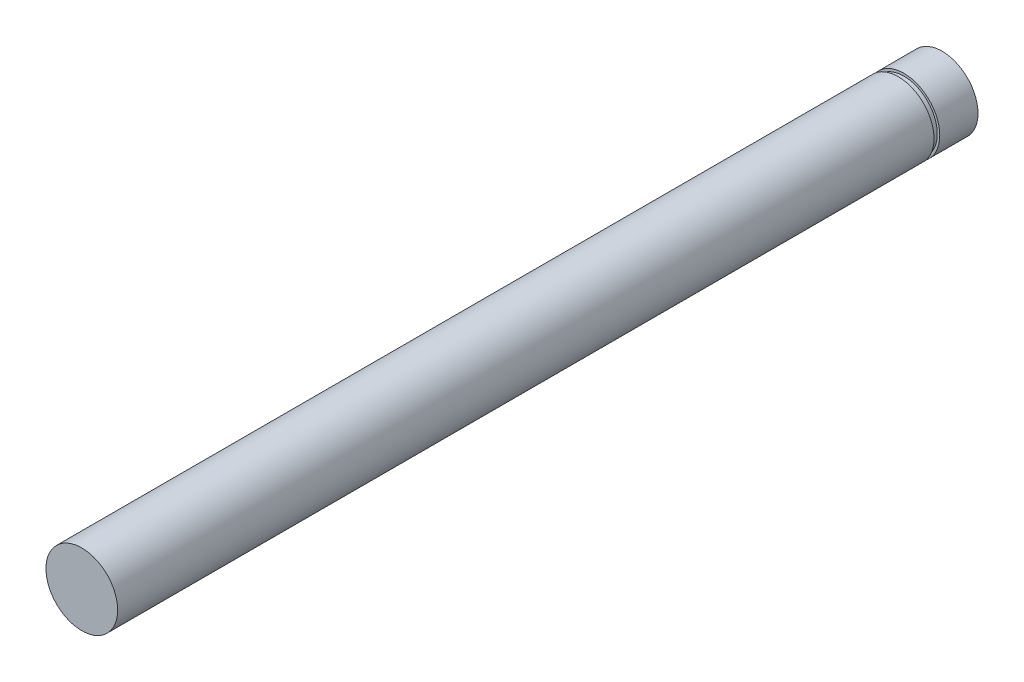
ISO-10303-21;
HEADER;
FILE_DESCRIPTION(('STEP AP214'),'2;1');
FILE_NAME('part.step','',(''),(''),'','','');
FILE_SCHEMA(('AUTOMOTIVE_DESIGN { 1 0 10303 214 1 1 1 1 }'));
ENDSEC;
DATA;
#1=APPLICATION_CONTEXT('core data for automotive mechanical design processes');
#2=APPLICATION_PROTOCOL_DEFINITION('international standard','automotive_design',2000,#1);
#3=PRODUCT_CONTEXT('',#1,'mechanical');
#4=PRODUCT('Part','Part','',(#3));
#5=PRODUCT_RELATED_PRODUCT_CATEGORY('part','',(#4));
#6=PRODUCT_DEFINITION_FORMATION('','',#4);
#7=PRODUCT_DEFINITION_CONTEXT('part definition',#1,'design');
#8=PRODUCT_DEFINITION('design','',#6,#7);
#9=PRODUCT_DEFINITION_SHAPE('','',#8);
#10=(LENGTH_UNIT() NAMED_UNIT(*) SI_UNIT(.MILLI.,.METRE.));
#11=(NAMED_UNIT(*) PLANE_ANGLE_UNIT() SI_UNIT($,.RADIAN.));
#12=(NAMED_UNIT(*) SI_UNIT($,.STERADIAN.) SOLID_ANGLE_UNIT());
#13=UNCERTAINTY_MEASURE_WITH_UNIT(LENGTH_MEASURE(1.E-05),#10,'distance_accuracy_value','');
#14=(GEOMETRIC_REPRESENTATION_CONTEXT(3) GLOBAL_UNCERTAINTY_ASSIGNED_CONTEXT((#13)) GLOBAL_UNIT_ASSIGNED_CONTEXT((#10,
#11,#12)) REPRESENTATION_CONTEXT('',''));
#15=CARTESIAN_POINT('',(0.,0.,0.));
#16=DIRECTION('',(0.,0.,1.));
#17=DIRECTION('',(1.,0.,0.));
#18=AXIS2_PLACEMENT_3D('',#15,#16,#17);
#19=CARTESIAN_POINT('',(0.,0.,-57.15));
#20=DIRECTION('',(0.,0.,1.));
#21=DIRECTION('',(1.,0.,0.));
#22=AXIS2_PLACEMENT_3D('',#19,#20,#21);
#23=CYLINDRICAL_SURFACE('',#22,2.38125);
#24=CARTESIAN_POINT('',(0.,0.,0.));
#25=DIRECTION('',(0.,0.,1.));
#26=DIRECTION('',(1.,0.,0.));
#27=AXIS2_PLACEMENT_3D('',#24,#25,#26);
#28=CIRCLE('',#27,2.38125);
#29=CARTESIAN_POINT('',(2.38125,0.,0.));
#30=VERTEX_POINT('',#29);
#31=EDGE_CURVE('E37',#30,#30,#28,.T.);
#32=ORIENTED_EDGE('',*,*,#31,.F.);
#33=EDGE_LOOP('',(#32));
#34=FACE_BOUND('',#33,.T.);
#35=CARTESIAN_POINT('',(0.,0.,-54.229));
#36=DIRECTION('',(0.,0.,-1.));
#37=DIRECTION('',(-1.,0.,0.));
#38=AXIS2_PLACEMENT_3D('',#35,#36,#37);
#39=CIRCLE('',#38,2.38125);
#40=CARTESIAN_POINT('',(-2.38125,0.,-54.229));
#41=VERTEX_POINT('',#40);
#42=EDGE_CURVE('E44',#41,#41,#39,.T.);
#43=ORIENTED_EDGE('',*,*,#42,.F.);
#44=EDGE_LOOP('',(#43));
#45=FACE_BOUND('',#44,.T.);
#46=ADVANCED_FACE('F33',(#34,#45),#23,.T.);
#47=CARTESIAN_POINT('',(0.,0.,0.));
#48=DIRECTION('',(0.,0.,1.));
#49=DIRECTION('',(1.,0.,0.));
#50=AXIS2_PLACEMENT_3D('',#47,#48,#49);
#51=PLANE('',#50);
#52=ORIENTED_EDGE('',*,*,#31,.T.);
#53=EDGE_LOOP('',(#52));
#54=FACE_BOUND('',#53,.T.);
#55=ADVANCED_FACE('F65',(#54),#51,.T.);
#56=CARTESIAN_POINT('',(0.,0.,-54.229));
#57=DIRECTION('',(0.,0.,-1.));
#58=DIRECTION('',(-1.,0.,0.));
#59=AXIS2_PLACEMENT_3D('',#56,#57,#58);
#60=PLANE('',#59);
#61=CARTESIAN_POINT('',(0.,0.,-54.229));
#62=DIRECTION('',(0.,0.,-1.));
#63=DIRECTION('',(-1.,0.,0.));
#64=AXIS2_PLACEMENT_3D('',#61,#62,#63);
#65=CIRCLE('',#64,2.21603932323596);
#66=CARTESIAN_POINT('',(-2.21603932323596,0.,-54.229));
#67=VERTEX_POINT('',#66);
#68=EDGE_CURVE('E49',#67,#67,#65,.T.);
#69=ORIENTED_EDGE('',*,*,#68,.F.);
#70=EDGE_LOOP('',(#69));
#71=FACE_BOUND('',#70,.T.);
#72=ORIENTED_EDGE('',*,*,#42,.T.);
#73=EDGE_LOOP('',(#72));
#74=FACE_BOUND('',#73,.T.);
#75=ADVANCED_FACE('F61',(#71,#74),#60,.T.);
#76=CARTESIAN_POINT('',(0.,0.,-54.61));
#77=DIRECTION('',(0.,0.,-1.));
#78=DIRECTION('',(-1.,0.,0.));
#79=AXIS2_PLACEMENT_3D('',#76,#77,#78);
#80=PLANE('',#79);
#81=CARTESIAN_POINT('',(0.,0.,-54.61));
#82=DIRECTION('',(0.,0.,-1.));
#83=DIRECTION('',(-1.,0.,0.));
#84=AXIS2_PLACEMENT_3D('',#81,#82,#83);
#85=CIRCLE('',#84,2.21603932323596);
#86=CARTESIAN_POINT('',(-2.21603932323596,0.,-54.61));
#87=VERTEX_POINT('',#86);
#88=EDGE_CURVE('E52',#87,#87,#85,.T.);
#89=ORIENTED_EDGE('',*,*,#88,.T.);
#90=EDGE_LOOP('',(#89));
#91=FACE_BOUND('',#90,.T.);
#92=CARTESIAN_POINT('',(0.,0.,-54.61));
#93=DIRECTION('',(0.,0.,-1.));
#94=DIRECTION('',(-1.,0.,0.));
#95=AXIS2_PLACEMENT_3D('',#92,#93,#94);
#96=CIRCLE('',#95,2.38125);
#97=CARTESIAN_POINT('',(-2.38125,0.,-54.61));
#98=VERTEX_POINT('',#97);
#99=EDGE_CURVE('E46',#98,#98,#96,.T.);
#100=ORIENTED_EDGE('',*,*,#99,.F.);
#101=EDGE_LOOP('',(#100));
#102=FACE_BOUND('',#101,.T.);
#103=ADVANCED_FACE('F64',(#91,#102),#80,.F.);
#104=CARTESIAN_POINT('',(0.,0.,-54.229));
#105=DIRECTION('',(0.,0.,-1.));
#106=DIRECTION('',(-1.,0.,0.));
#107=AXIS2_PLACEMENT_3D('',#104,#105,#106);
#108=CYLINDRICAL_SURFACE('',#107,2.21603932323596);
#109=CARTESIAN_POINT('',(-2.21603932323596,0.,-54.229));
#110=CARTESIAN_POINT('',(-2.21603932323596,0.,-54.23296875));
#111=CARTESIAN_POINT('',(-2.21603932323596,0.,-54.2369375));
#112=CARTESIAN_POINT('',(-2.21603932323596,0.,-54.244875));
#113=CARTESIAN_POINT('',(-2.21603932323596,0.,-54.24884375));
#114=CARTESIAN_POINT('',(-2.21603932323596,0.,-54.25678125));
#115=CARTESIAN_POINT('',(-2.21603932323596,0.,-54.26075));
#116=CARTESIAN_POINT('',(-2.21603932323596,0.,-54.2686875));
#117=CARTESIAN_POINT('',(-2.21603932323596,0.,-54.27265625));
#118=CARTESIAN_POINT('',(-2.21603932323596,0.,-54.28059375));
#119=CARTESIAN_POINT('',(-2.21603932323596,0.,-54.2845625));
#120=CARTESIAN_POINT('',(-2.21603932323596,0.,-54.2925));
#121=CARTESIAN_POINT('',(-2.21603932323596,0.,-54.29646875));
#122=CARTESIAN_POINT('',(-2.21603932323596,0.,-54.30440625));
#123=CARTESIAN_POINT('',(-2.21603932323596,0.,-54.308375));
#124=CARTESIAN_POINT('',(-2.21603932323596,0.,-54.3163125));
#125=CARTESIAN_POINT('',(-2.21603932323596,0.,-54.32028125));
#126=CARTESIAN_POINT('',(-2.21603932323596,0.,-54.32821875));
#127=CARTESIAN_POINT('',(-2.21603932323596,0.,-54.3321875));
#128=CARTESIAN_POINT('',(-2.21603932323596,0.,-54.340125));
#129=CARTESIAN_POINT('',(-2.21603932323596,0.,-54.34409375));
#130=CARTESIAN_POINT('',(-2.21603932323596,0.,-54.35203125));
#131=CARTESIAN_POINT('',(-2.21603932323596,0.,-54.356));
#132=CARTESIAN_POINT('',(-2.21603932323596,0.,-54.3639375));
#133=CARTESIAN_POINT('',(-2.21603932323596,0.,-54.36790625));
#134=CARTESIAN_POINT('',(-2.21603932323596,0.,-54.37584375));
#135=CARTESIAN_POINT('',(-2.21603932323596,0.,-54.3798125));
#136=CARTESIAN_POINT('',(-2.21603932323596,0.,-54.38775));
#137=CARTESIAN_POINT('',(-2.21603932323596,0.,-54.39171875));
#138=CARTESIAN_POINT('',(-2.21603932323596,0.,-54.39965625));
#139=CARTESIAN_POINT('',(-2.21603932323596,0.,-54.403625));
#140=CARTESIAN_POINT('',(-2.21603932323596,0.,-54.4115625));
#141=CARTESIAN_POINT('',(-2.21603932323596,0.,-54.41553125));
#142=CARTESIAN_POINT('',(-2.21603932323596,0.,-54.42346875));
#143=CARTESIAN_POINT('',(-2.21603932323596,0.,-54.4274375));
#144=CARTESIAN_POINT('',(-2.21603932323596,0.,-54.435375));
#145=CARTESIAN_POINT('',(-2.21603932323596,0.,-54.43934375));
#146=CARTESIAN_POINT('',(-2.21603932323596,0.,-54.44728125));
#147=CARTESIAN_POINT('',(-2.21603932323596,0.,-54.45125));
#148=CARTESIAN_POINT('',(-2.21603932323596,0.,-54.4591875));
#149=CARTESIAN_POINT('',(-2.21603932323596,0.,-54.46315625));
#150=CARTESIAN_POINT('',(-2.21603932323596,0.,-54.47109375));
#151=CARTESIAN_POINT('',(-2.21603932323596,0.,-54.4750625));
#152=CARTESIAN_POINT('',(-2.21603932323596,0.,-54.483));
#153=CARTESIAN_POINT('',(-2.21603932323596,0.,-54.48696875));
#154=CARTESIAN_POINT('',(-2.21603932323596,0.,-54.49490625));
#155=CARTESIAN_POINT('',(-2.21603932323596,0.,-54.498875));
#156=CARTESIAN_POINT('',(-2.21603932323596,0.,-54.5068125));
#157=CARTESIAN_POINT('',(-2.21603932323596,0.,-54.51078125));
#158=CARTESIAN_POINT('',(-2.21603932323596,0.,-54.51871875));
#159=CARTESIAN_POINT('',(-2.21603932323596,0.,-54.5226875));
#160=CARTESIAN_POINT('',(-2.21603932323596,0.,-54.530625));
#161=CARTESIAN_POINT('',(-2.21603932323596,0.,-54.53459375));
#162=CARTESIAN_POINT('',(-2.21603932323596,0.,-54.54253125));
#163=CARTESIAN_POINT('',(-2.21603932323596,0.,-54.5465));
#164=CARTESIAN_POINT('',(-2.21603932323596,0.,-54.5544375));
#165=CARTESIAN_POINT('',(-2.21603932323596,0.,-54.55840625));
#166=CARTESIAN_POINT('',(-2.21603932323596,0.,-54.56634375));
#167=CARTESIAN_POINT('',(-2.21603932323596,0.,-54.5703125));
#168=CARTESIAN_POINT('',(-2.21603932323596,0.,-54.57825));
#169=CARTESIAN_POINT('',(-2.21603932323596,0.,-54.58221875));
#170=CARTESIAN_POINT('',(-2.21603932323596,0.,-54.59015625));
#171=CARTESIAN_POINT('',(-2.21603932323596,0.,-54.594125));
#172=CARTESIAN_POINT('',(-2.21603932323596,0.,-54.6020625));
#173=CARTESIAN_POINT('',(-2.21603932323596,0.,-54.60603125));
#174=CARTESIAN_POINT('',(-2.21603932323596,0.,-54.61));
#175=B_SPLINE_CURVE_WITH_KNOTS('',3,(#109,#110,#111,#112,#113,#114,#115,#116,#117,#118,#119,
#120,#121,#122,#123,#124,#125,#126,#127,#128,#129,#130,#131,#132,#133,#134,#135,#136,#137,#138,
#139,#140,#141,#142,#143,#144,#145,#146,#147,#148,#149,#150,#151,#152,#153,#154,#155,#156,#157,
#158,#159,#160,#161,#162,#163,#164,#165,#166,#167,#168,#169,#170,#171,#172,#173,#174),
.UNSPECIFIED.,.F.,.F.,(4,2,2,2,2,2,2,2,2,2,2,2,2,2,2,2,2,2,2,2,2,2,2,2,2,2,2,2,2,2,2,2,4),(0.,
0.0119062500000058,0.0238125000000047,0.0357187500000036,0.0476250000000025,0.0595312500000014,
0.0714375000000003,0.0833437500000062,0.0952500000000051,0.107156250000004,0.119062500000003,
0.130968750000002,0.142875000000001,0.154781250000006,0.166687500000005,0.178593750000004,
0.190500000000003,0.202406250000002,0.214312500000001,0.22621875,0.238125000000006,
0.250031250000005,0.261937500000003,0.273843750000002,0.285750000000001,0.29765625,
0.309562500000006,0.321468750000005,0.333375000000004,0.345281250000003,0.357187500000002,
0.36909375,0.381000000000006),.UNSPECIFIED.);
#176=EDGE_CURVE('BSEAM58',#67,#87,#175,.T.);
#177=ORIENTED_EDGE('',*,*,#68,.T.);
#178=ORIENTED_EDGE('',*,*,#88,.F.);
#179=ORIENTED_EDGE('',*,*,#176,.T.);
#180=ORIENTED_EDGE('',*,*,#176,.F.);
#181=EDGE_LOOP('',(#177,#179,#178,#180));
#182=FACE_BOUND('',#181,.T.);
#183=ADVANCED_FACE('F58',(#182),#108,.T.);
#184=CARTESIAN_POINT('',(0.,0.,-57.15));
#185=DIRECTION('',(0.,0.,1.));
#186=DIRECTION('',(1.,0.,0.));
#187=AXIS2_PLACEMENT_3D('',#184,#185,#186);
#188=PLANE('',#187);
#189=CARTESIAN_POINT('',(0.,0.,-57.15));
#190=DIRECTION('',(0.,0.,1.));
#191=DIRECTION('',(1.,0.,0.));
#192=AXIS2_PLACEMENT_3D('',#189,#190,#191);
#193=CIRCLE('',#192,2.38125);
#194=CARTESIAN_POINT('',(2.38125,0.,-57.15));
#195=VERTEX_POINT('',#194);
#196=EDGE_CURVE('E10',#195,#195,#193,.T.);
#197=ORIENTED_EDGE('',*,*,#196,.F.);
#198=EDGE_LOOP('',(#197));
#199=FACE_BOUND('',#198,.T.);
#200=ADVANCED_FACE('F77',(#199),#188,.F.);
#201=ORIENTED_EDGE('',*,*,#99,.T.);
#202=EDGE_LOOP('',(#201));
#203=FACE_BOUND('',#202,.T.);
#204=ORIENTED_EDGE('',*,*,#196,.T.);
#205=EDGE_LOOP('',(#204));
#206=FACE_BOUND('',#205,.T.);
#207=ADVANCED_FACE('F35',(#203,#206),#23,.T.);
#208=CLOSED_SHELL('',(#46,#55,#75,#103,#183,#200,#207));
#209=MANIFOLD_SOLID_BREP('B2',#208);
#210=ADVANCED_BREP_SHAPE_REPRESENTATION('',(#18,#209),#14);
#211=SHAPE_DEFINITION_REPRESENTATION(#9,#210);
ENDSEC;
END-ISO-10303-21;
